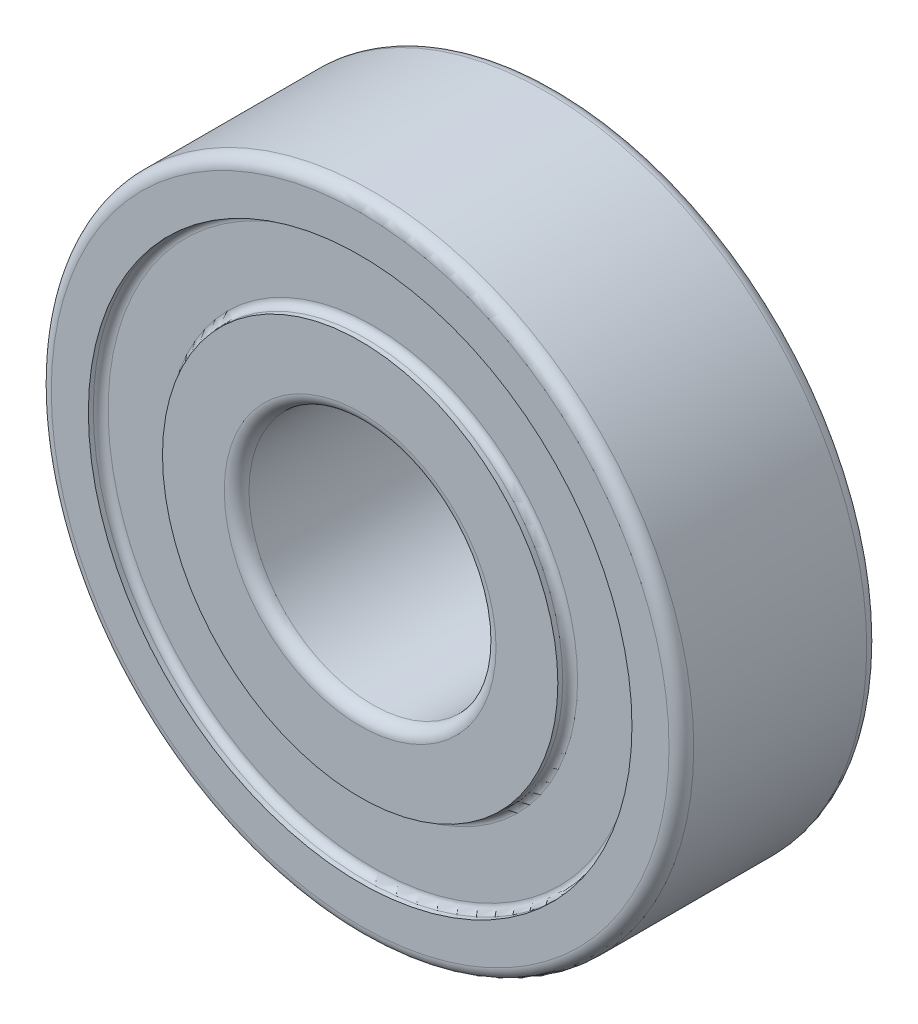
ISO-10303-21;
HEADER;
FILE_DESCRIPTION(('STEP AP214'),'2;1');
FILE_NAME('part.step','',(''),(''),'','','');
FILE_SCHEMA(('AUTOMOTIVE_DESIGN { 1 0 10303 214 1 1 1 1 }'));
ENDSEC;
DATA;
#1=APPLICATION_CONTEXT('core data for automotive mechanical design processes');
#2=APPLICATION_PROTOCOL_DEFINITION('international standard','automotive_design',2000,#1);
#3=PRODUCT_CONTEXT('',#1,'mechanical');
#4=PRODUCT('Part','Part','',(#3));
#5=PRODUCT_RELATED_PRODUCT_CATEGORY('part','',(#4));
#6=PRODUCT_DEFINITION_FORMATION('','',#4);
#7=PRODUCT_DEFINITION_CONTEXT('part definition',#1,'design');
#8=PRODUCT_DEFINITION('design','',#6,#7);
#9=PRODUCT_DEFINITION_SHAPE('','',#8);
#10=(LENGTH_UNIT() NAMED_UNIT(*) SI_UNIT(.MILLI.,.METRE.));
#11=(NAMED_UNIT(*) PLANE_ANGLE_UNIT() SI_UNIT($,.RADIAN.));
#12=(NAMED_UNIT(*) SI_UNIT($,.STERADIAN.) SOLID_ANGLE_UNIT());
#13=UNCERTAINTY_MEASURE_WITH_UNIT(LENGTH_MEASURE(1.E-05),#10,'distance_accuracy_value','');
#14=(GEOMETRIC_REPRESENTATION_CONTEXT(3) GLOBAL_UNCERTAINTY_ASSIGNED_CONTEXT((#13)) GLOBAL_UNIT_ASSIGNED_CONTEXT((#10,
#11,#12)) REPRESENTATION_CONTEXT('',''));
#15=CARTESIAN_POINT('',(0.,0.,0.));
#16=DIRECTION('',(0.,0.,1.));
#17=DIRECTION('',(1.,0.,0.));
#18=AXIS2_PLACEMENT_3D('',#15,#16,#17);
#19=CARTESIAN_POINT('',(0.,0.,8.));
#20=DIRECTION('',(0.,0.,1.));
#21=DIRECTION('',(1.,0.,0.));
#22=AXIS2_PLACEMENT_3D('',#19,#20,#21);
#23=PLANE('',#22);
#24=CARTESIAN_POINT('',(0.,0.,8.));
#25=DIRECTION('',(0.,0.,1.));
#26=DIRECTION('',(1.,0.,0.));
#27=AXIS2_PLACEMENT_3D('',#24,#25,#26);
#28=CIRCLE('',#27,5.5);
#29=CARTESIAN_POINT('',(5.5,0.,8.));
#30=VERTEX_POINT('',#29);
#31=EDGE_CURVE('E66',#30,#30,#28,.F.);
#32=ORIENTED_EDGE('',*,*,#31,.T.);
#33=EDGE_LOOP('',(#32));
#34=FACE_BOUND('',#33,.T.);
#35=CARTESIAN_POINT('',(0.,0.,8.));
#36=DIRECTION('',(0.,0.,1.));
#37=DIRECTION('',(1.,0.,0.));
#38=AXIS2_PLACEMENT_3D('',#35,#36,#37);
#39=CIRCLE('',#38,8.);
#40=CARTESIAN_POINT('',(8.,0.,8.));
#41=VERTEX_POINT('',#40);
#42=EDGE_CURVE('E99',#41,#41,#39,.T.);
#43=ORIENTED_EDGE('',*,*,#42,.T.);
#44=EDGE_LOOP('',(#43));
#45=FACE_BOUND('',#44,.T.);
#46=ADVANCED_FACE('F34',(#34,#45),#23,.T.);
#47=CARTESIAN_POINT('',(0.,0.,0.));
#48=DIRECTION('',(0.,0.,1.));
#49=DIRECTION('',(1.,0.,0.));
#50=AXIS2_PLACEMENT_3D('',#47,#48,#49);
#51=PLANE('',#50);
#52=CARTESIAN_POINT('',(0.,0.,0.));
#53=DIRECTION('',(0.,0.,1.));
#54=DIRECTION('',(1.,0.,0.));
#55=AXIS2_PLACEMENT_3D('',#52,#53,#54);
#56=CIRCLE('',#55,5.5);
#57=CARTESIAN_POINT('',(5.5,0.,0.));
#58=VERTEX_POINT('',#57);
#59=EDGE_CURVE('E84',#58,#58,#56,.T.);
#60=ORIENTED_EDGE('',*,*,#59,.T.);
#61=EDGE_LOOP('',(#60));
#62=FACE_BOUND('',#61,.T.);
#63=CARTESIAN_POINT('',(0.,0.,0.));
#64=DIRECTION('',(0.,0.,-1.));
#65=DIRECTION('',(-1.,0.,0.));
#66=AXIS2_PLACEMENT_3D('',#63,#64,#65);
#67=CIRCLE('',#66,8.);
#68=CARTESIAN_POINT('',(-8.,0.,0.));
#69=VERTEX_POINT('',#68);
#70=EDGE_CURVE('E93',#69,#69,#67,.T.);
#71=ORIENTED_EDGE('',*,*,#70,.T.);
#72=EDGE_LOOP('',(#71));
#73=FACE_BOUND('',#72,.T.);
#74=ADVANCED_FACE('F120',(#62,#73),#51,.F.);
#75=CARTESIAN_POINT('',(0.,0.,8.));
#76=DIRECTION('',(0.,0.,1.));
#77=DIRECTION('',(1.,0.,0.));
#78=AXIS2_PLACEMENT_3D('',#75,#76,#77);
#79=CIRCLE('',#78,11.);
#80=CARTESIAN_POINT('',(11.,0.,8.));
#81=VERTEX_POINT('',#80);
#82=EDGE_CURVE('E96',#81,#81,#79,.T.);
#83=ORIENTED_EDGE('',*,*,#82,.F.);
#84=EDGE_LOOP('',(#83));
#85=FACE_BOUND('',#84,.T.);
#86=CARTESIAN_POINT('',(0.,0.,8.));
#87=DIRECTION('',(0.,0.,1.));
#88=DIRECTION('',(1.,0.,0.));
#89=AXIS2_PLACEMENT_3D('',#86,#87,#88);
#90=CIRCLE('',#89,12.5);
#91=CARTESIAN_POINT('',(12.5,0.,8.));
#92=VERTEX_POINT('',#91);
#93=EDGE_CURVE('E69',#92,#92,#90,.T.);
#94=ORIENTED_EDGE('',*,*,#93,.T.);
#95=EDGE_LOOP('',(#94));
#96=FACE_BOUND('',#95,.T.);
#97=ADVANCED_FACE('F123',(#85,#96),#23,.T.);
#98=CARTESIAN_POINT('',(0.,0.,0.));
#99=DIRECTION('',(0.,0.,-1.));
#100=DIRECTION('',(-1.,0.,0.));
#101=AXIS2_PLACEMENT_3D('',#98,#99,#100);
#102=CIRCLE('',#101,11.);
#103=CARTESIAN_POINT('',(-11.,0.,0.));
#104=VERTEX_POINT('',#103);
#105=EDGE_CURVE('E90',#104,#104,#102,.T.);
#106=ORIENTED_EDGE('',*,*,#105,.F.);
#107=EDGE_LOOP('',(#106));
#108=FACE_BOUND('',#107,.T.);
#109=CARTESIAN_POINT('',(0.,0.,0.));
#110=DIRECTION('',(0.,0.,1.));
#111=DIRECTION('',(1.,0.,0.));
#112=AXIS2_PLACEMENT_3D('',#109,#110,#111);
#113=CIRCLE('',#112,12.5);
#114=CARTESIAN_POINT('',(12.5,0.,0.));
#115=VERTEX_POINT('',#114);
#116=EDGE_CURVE('E87',#115,#115,#113,.F.);
#117=ORIENTED_EDGE('',*,*,#116,.T.);
#118=EDGE_LOOP('',(#117));
#119=FACE_BOUND('',#118,.T.);
#120=ADVANCED_FACE('F129',(#108,#119),#51,.F.);
#121=CARTESIAN_POINT('',(0.,0.,8.));
#122=DIRECTION('',(0.,0.,-1.));
#123=DIRECTION('',(-1.,0.,0.));
#124=AXIS2_PLACEMENT_3D('',#121,#122,#123);
#125=CYLINDRICAL_SURFACE('',#124,13.);
#126=CARTESIAN_POINT('',(0.,0.,0.5));
#127=DIRECTION('',(0.,0.,1.));
#128=DIRECTION('',(1.,0.,0.));
#129=AXIS2_PLACEMENT_3D('',#126,#127,#128);
#130=CIRCLE('',#129,13.);
#131=CARTESIAN_POINT('',(13.,0.,0.5));
#132=VERTEX_POINT('',#131);
#133=EDGE_CURVE('E72',#132,#132,#130,.T.);
#134=ORIENTED_EDGE('',*,*,#133,.T.);
#135=EDGE_LOOP('',(#134));
#136=FACE_BOUND('',#135,.T.);
#137=CARTESIAN_POINT('',(0.,0.,7.5));
#138=DIRECTION('',(0.,0.,1.));
#139=DIRECTION('',(1.,0.,0.));
#140=AXIS2_PLACEMENT_3D('',#137,#138,#139);
#141=CIRCLE('',#140,13.);
#142=CARTESIAN_POINT('',(13.,0.,7.5));
#143=VERTEX_POINT('',#142);
#144=EDGE_CURVE('E75',#143,#143,#141,.F.);
#145=ORIENTED_EDGE('',*,*,#144,.T.);
#146=EDGE_LOOP('',(#145));
#147=FACE_BOUND('',#146,.T.);
#148=ADVANCED_FACE('F136',(#136,#147),#125,.T.);
#149=CARTESIAN_POINT('',(0.,0.,8.));
#150=DIRECTION('',(0.,0.,-1.));
#151=DIRECTION('',(-1.,0.,0.));
#152=AXIS2_PLACEMENT_3D('',#149,#150,#151);
#153=CYLINDRICAL_SURFACE('',#152,5.);
#154=CARTESIAN_POINT('',(0.,0.,0.5));
#155=DIRECTION('',(0.,0.,1.));
#156=DIRECTION('',(1.,0.,0.));
#157=AXIS2_PLACEMENT_3D('',#154,#155,#156);
#158=CIRCLE('',#157,5.);
#159=CARTESIAN_POINT('',(5.,0.,0.5));
#160=VERTEX_POINT('',#159);
#161=EDGE_CURVE('E78',#160,#160,#158,.F.);
#162=ORIENTED_EDGE('',*,*,#161,.T.);
#163=EDGE_LOOP('',(#162));
#164=FACE_BOUND('',#163,.T.);
#165=CARTESIAN_POINT('',(0.,0.,7.5));
#166=DIRECTION('',(0.,0.,1.));
#167=DIRECTION('',(1.,0.,0.));
#168=AXIS2_PLACEMENT_3D('',#165,#166,#167);
#169=CIRCLE('',#168,5.);
#170=CARTESIAN_POINT('',(5.,0.,7.5));
#171=VERTEX_POINT('',#170);
#172=EDGE_CURVE('E81',#171,#171,#169,.T.);
#173=ORIENTED_EDGE('',*,*,#172,.T.);
#174=EDGE_LOOP('',(#173));
#175=FACE_BOUND('',#174,.T.);
#176=ADVANCED_FACE('F286',(#164,#175),#153,.F.);
#177=CARTESIAN_POINT('',(0.,0.,0.5));
#178=DIRECTION('',(0.,0.,1.));
#179=DIRECTION('',(1.,0.,0.));
#180=AXIS2_PLACEMENT_3D('',#177,#178,#179);
#181=TOROIDAL_SURFACE('',#180,5.5,0.5);
#182=ORIENTED_EDGE('',*,*,#161,.F.);
#183=EDGE_LOOP('',(#182));
#184=FACE_BOUND('',#183,.T.);
#185=ORIENTED_EDGE('',*,*,#59,.F.);
#186=EDGE_LOOP('',(#185));
#187=FACE_BOUND('',#186,.T.);
#188=ADVANCED_FACE('F277',(#184,#187),#181,.T.);
#189=CARTESIAN_POINT('',(0.,0.,0.5));
#190=DIRECTION('',(0.,0.,1.));
#191=DIRECTION('',(1.,0.,0.));
#192=AXIS2_PLACEMENT_3D('',#189,#190,#191);
#193=TOROIDAL_SURFACE('',#192,12.5,0.5);
#194=ORIENTED_EDGE('',*,*,#116,.F.);
#195=EDGE_LOOP('',(#194));
#196=FACE_BOUND('',#195,.T.);
#197=ORIENTED_EDGE('',*,*,#133,.F.);
#198=EDGE_LOOP('',(#197));
#199=FACE_BOUND('',#198,.T.);
#200=ADVANCED_FACE('F155',(#196,#199),#193,.T.);
#201=CARTESIAN_POINT('',(0.,0.,7.5));
#202=DIRECTION('',(0.,0.,1.));
#203=DIRECTION('',(1.,0.,0.));
#204=AXIS2_PLACEMENT_3D('',#201,#202,#203);
#205=TOROIDAL_SURFACE('',#204,5.5,0.5);
#206=ORIENTED_EDGE('',*,*,#31,.F.);
#207=EDGE_LOOP('',(#206));
#208=FACE_BOUND('',#207,.T.);
#209=ORIENTED_EDGE('',*,*,#172,.F.);
#210=EDGE_LOOP('',(#209));
#211=FACE_BOUND('',#210,.T.);
#212=ADVANCED_FACE('F145',(#208,#211),#205,.T.);
#213=CARTESIAN_POINT('',(0.,0.,7.5));
#214=DIRECTION('',(0.,0.,1.));
#215=DIRECTION('',(1.,0.,0.));
#216=AXIS2_PLACEMENT_3D('',#213,#214,#215);
#217=TOROIDAL_SURFACE('',#216,12.5,0.5);
#218=ORIENTED_EDGE('',*,*,#144,.F.);
#219=EDGE_LOOP('',(#218));
#220=FACE_BOUND('',#219,.T.);
#221=ORIENTED_EDGE('',*,*,#93,.F.);
#222=EDGE_LOOP('',(#221));
#223=FACE_BOUND('',#222,.T.);
#224=ADVANCED_FACE('F142',(#220,#223),#217,.T.);
#225=CARTESIAN_POINT('',(0.,0.,0.5));
#226=DIRECTION('',(0.,0.,-1.));
#227=DIRECTION('',(-1.,0.,0.));
#228=AXIS2_PLACEMENT_3D('',#225,#226,#227);
#229=CYLINDRICAL_SURFACE('',#228,11.);
#230=CARTESIAN_POINT('',(0.,0.,0.2));
#231=DIRECTION('',(0.,0.,-1.));
#232=DIRECTION('',(-1.,0.,0.));
#233=AXIS2_PLACEMENT_3D('',#230,#231,#232);
#234=CIRCLE('',#233,11.);
#235=CARTESIAN_POINT('',(-11.,0.,0.2));
#236=VERTEX_POINT('',#235);
#237=EDGE_CURVE('E57',#236,#236,#234,.F.);
#238=ORIENTED_EDGE('',*,*,#237,.T.);
#239=EDGE_LOOP('',(#238));
#240=FACE_BOUND('',#239,.T.);
#241=ORIENTED_EDGE('',*,*,#105,.T.);
#242=EDGE_LOOP('',(#241));
#243=FACE_BOUND('',#242,.T.);
#244=ADVANCED_FACE('F144',(#240,#243),#229,.F.);
#245=CARTESIAN_POINT('',(0.,0.,0.5));
#246=DIRECTION('',(0.,0.,-1.));
#247=DIRECTION('',(-1.,0.,0.));
#248=AXIS2_PLACEMENT_3D('',#245,#246,#247);
#249=PLANE('',#248);
#250=CARTESIAN_POINT('',(0.,0.,0.5));
#251=DIRECTION('',(0.,0.,-1.));
#252=DIRECTION('',(-1.,0.,0.));
#253=AXIS2_PLACEMENT_3D('',#250,#251,#252);
#254=CIRCLE('',#253,10.7);
#255=CARTESIAN_POINT('',(-10.7,0.,0.5));
#256=VERTEX_POINT('',#255);
#257=EDGE_CURVE('E60',#256,#256,#254,.T.);
#258=ORIENTED_EDGE('',*,*,#257,.T.);
#259=EDGE_LOOP('',(#258));
#260=FACE_BOUND('',#259,.T.);
#261=CARTESIAN_POINT('',(0.,0.,0.5));
#262=DIRECTION('',(0.,0.,-1.));
#263=DIRECTION('',(-1.,0.,0.));
#264=AXIS2_PLACEMENT_3D('',#261,#262,#263);
#265=CIRCLE('',#264,8.3);
#266=CARTESIAN_POINT('',(-8.3,0.,0.5));
#267=VERTEX_POINT('',#266);
#268=EDGE_CURVE('E63',#267,#267,#265,.F.);
#269=ORIENTED_EDGE('',*,*,#268,.T.);
#270=EDGE_LOOP('',(#269));
#271=FACE_BOUND('',#270,.T.);
#272=ADVANCED_FACE('F152',(#260,#271),#249,.T.);
#273=CARTESIAN_POINT('',(0.,0.,0.5));
#274=DIRECTION('',(0.,0.,-1.));
#275=DIRECTION('',(-1.,0.,0.));
#276=AXIS2_PLACEMENT_3D('',#273,#274,#275);
#277=CYLINDRICAL_SURFACE('',#276,8.);
#278=CARTESIAN_POINT('',(0.,0.,0.2));
#279=DIRECTION('',(0.,0.,-1.));
#280=DIRECTION('',(-1.,0.,0.));
#281=AXIS2_PLACEMENT_3D('',#278,#279,#280);
#282=CIRCLE('',#281,8.);
#283=CARTESIAN_POINT('',(-8.,0.,0.2));
#284=VERTEX_POINT('',#283);
#285=EDGE_CURVE('E54',#284,#284,#282,.T.);
#286=ORIENTED_EDGE('',*,*,#285,.T.);
#287=EDGE_LOOP('',(#286));
#288=FACE_BOUND('',#287,.T.);
#289=ORIENTED_EDGE('',*,*,#70,.F.);
#290=EDGE_LOOP('',(#289));
#291=FACE_BOUND('',#290,.T.);
#292=ADVANCED_FACE('F212',(#288,#291),#277,.T.);
#293=CARTESIAN_POINT('',(0.,0.,7.5));
#294=DIRECTION('',(0.,0.,1.));
#295=DIRECTION('',(1.,0.,0.));
#296=AXIS2_PLACEMENT_3D('',#293,#294,#295);
#297=CYLINDRICAL_SURFACE('',#296,11.);
#298=CARTESIAN_POINT('',(0.,0.,7.8));
#299=DIRECTION('',(0.,0.,1.));
#300=DIRECTION('',(1.,0.,0.));
#301=AXIS2_PLACEMENT_3D('',#298,#299,#300);
#302=CIRCLE('',#301,11.);
#303=CARTESIAN_POINT('',(11.,0.,7.8));
#304=VERTEX_POINT('',#303);
#305=EDGE_CURVE('E41',#304,#304,#302,.F.);
#306=ORIENTED_EDGE('',*,*,#305,.T.);
#307=EDGE_LOOP('',(#306));
#308=FACE_BOUND('',#307,.T.);
#309=ORIENTED_EDGE('',*,*,#82,.T.);
#310=EDGE_LOOP('',(#309));
#311=FACE_BOUND('',#310,.T.);
#312=ADVANCED_FACE('F116',(#308,#311),#297,.F.);
#313=CARTESIAN_POINT('',(0.,0.,7.5));
#314=DIRECTION('',(0.,0.,1.));
#315=DIRECTION('',(1.,0.,0.));
#316=AXIS2_PLACEMENT_3D('',#313,#314,#315);
#317=PLANE('',#316);
#318=CARTESIAN_POINT('',(0.,0.,7.5));
#319=DIRECTION('',(0.,0.,1.));
#320=DIRECTION('',(1.,0.,0.));
#321=AXIS2_PLACEMENT_3D('',#318,#319,#320);
#322=CIRCLE('',#321,10.7);
#323=CARTESIAN_POINT('',(10.7,0.,7.5));
#324=VERTEX_POINT('',#323);
#325=EDGE_CURVE('E45',#324,#324,#322,.T.);
#326=ORIENTED_EDGE('',*,*,#325,.T.);
#327=EDGE_LOOP('',(#326));
#328=FACE_BOUND('',#327,.T.);
#329=CARTESIAN_POINT('',(0.,0.,7.5));
#330=DIRECTION('',(0.,0.,1.));
#331=DIRECTION('',(1.,0.,0.));
#332=AXIS2_PLACEMENT_3D('',#329,#330,#331);
#333=CIRCLE('',#332,8.3);
#334=CARTESIAN_POINT('',(8.3,0.,7.5));
#335=VERTEX_POINT('',#334);
#336=EDGE_CURVE('E49',#335,#335,#333,.F.);
#337=ORIENTED_EDGE('',*,*,#336,.T.);
#338=EDGE_LOOP('',(#337));
#339=FACE_BOUND('',#338,.T.);
#340=ADVANCED_FACE('F107',(#328,#339),#317,.T.);
#341=CARTESIAN_POINT('',(0.,0.,7.5));
#342=DIRECTION('',(0.,0.,1.));
#343=DIRECTION('',(1.,0.,0.));
#344=AXIS2_PLACEMENT_3D('',#341,#342,#343);
#345=CYLINDRICAL_SURFACE('',#344,8.);
#346=CARTESIAN_POINT('',(0.,0.,7.8));
#347=DIRECTION('',(0.,0.,1.));
#348=DIRECTION('',(1.,0.,0.));
#349=AXIS2_PLACEMENT_3D('',#346,#347,#348);
#350=CIRCLE('',#349,8.);
#351=CARTESIAN_POINT('',(8.,0.,7.8));
#352=VERTEX_POINT('',#351);
#353=EDGE_CURVE('E10',#352,#352,#350,.T.);
#354=ORIENTED_EDGE('',*,*,#353,.T.);
#355=EDGE_LOOP('',(#354));
#356=FACE_BOUND('',#355,.T.);
#357=ORIENTED_EDGE('',*,*,#42,.F.);
#358=EDGE_LOOP('',(#357));
#359=FACE_BOUND('',#358,.T.);
#360=ADVANCED_FACE('F104',(#356,#359),#345,.T.);
#361=CARTESIAN_POINT('',(0.,0.,0.2));
#362=DIRECTION('',(0.,0.,-1.));
#363=DIRECTION('',(-1.,0.,0.));
#364=AXIS2_PLACEMENT_3D('',#361,#362,#363);
#365=TOROIDAL_SURFACE('',#364,10.7,0.3);
#366=ORIENTED_EDGE('',*,*,#237,.F.);
#367=EDGE_LOOP('',(#366));
#368=FACE_BOUND('',#367,.T.);
#369=ORIENTED_EDGE('',*,*,#257,.F.);
#370=EDGE_LOOP('',(#369));
#371=FACE_BOUND('',#370,.T.);
#372=ADVANCED_FACE('F106',(#368,#371),#365,.F.);
#373=CARTESIAN_POINT('',(0.,0.,0.2));
#374=DIRECTION('',(0.,0.,-1.));
#375=DIRECTION('',(-1.,0.,0.));
#376=AXIS2_PLACEMENT_3D('',#373,#374,#375);
#377=TOROIDAL_SURFACE('',#376,8.3,0.3);
#378=ORIENTED_EDGE('',*,*,#268,.F.);
#379=EDGE_LOOP('',(#378));
#380=FACE_BOUND('',#379,.T.);
#381=ORIENTED_EDGE('',*,*,#285,.F.);
#382=EDGE_LOOP('',(#381));
#383=FACE_BOUND('',#382,.T.);
#384=ADVANCED_FACE('F113',(#380,#383),#377,.F.);
#385=CARTESIAN_POINT('',(0.,0.,7.8));
#386=DIRECTION('',(0.,0.,1.));
#387=DIRECTION('',(1.,0.,0.));
#388=AXIS2_PLACEMENT_3D('',#385,#386,#387);
#389=TOROIDAL_SURFACE('',#388,10.7,0.3);
#390=ORIENTED_EDGE('',*,*,#305,.F.);
#391=EDGE_LOOP('',(#390));
#392=FACE_BOUND('',#391,.T.);
#393=ORIENTED_EDGE('',*,*,#325,.F.);
#394=EDGE_LOOP('',(#393));
#395=FACE_BOUND('',#394,.T.);
#396=ADVANCED_FACE('F162',(#392,#395),#389,.F.);
#397=CARTESIAN_POINT('',(0.,0.,7.8));
#398=DIRECTION('',(0.,0.,1.));
#399=DIRECTION('',(1.,0.,0.));
#400=AXIS2_PLACEMENT_3D('',#397,#398,#399);
#401=TOROIDAL_SURFACE('',#400,8.3,0.3);
#402=ORIENTED_EDGE('',*,*,#336,.F.);
#403=EDGE_LOOP('',(#402));
#404=FACE_BOUND('',#403,.T.);
#405=ORIENTED_EDGE('',*,*,#353,.F.);
#406=EDGE_LOOP('',(#405));
#407=FACE_BOUND('',#406,.T.);
#408=ADVANCED_FACE('F36',(#404,#407),#401,.F.);
#409=CLOSED_SHELL('',(#46,#74,#97,#120,#148,#176,#188,#200,#212,#224,#244,#272,#292,#312,#340,
#360,#372,#384,#396,#408));
#410=MANIFOLD_SOLID_BREP('B2',#409);
#411=ADVANCED_BREP_SHAPE_REPRESENTATION('',(#18,#410),#14);
#412=SHAPE_DEFINITION_REPRESENTATION(#9,#411);
ENDSEC;
END-ISO-10303-21;
